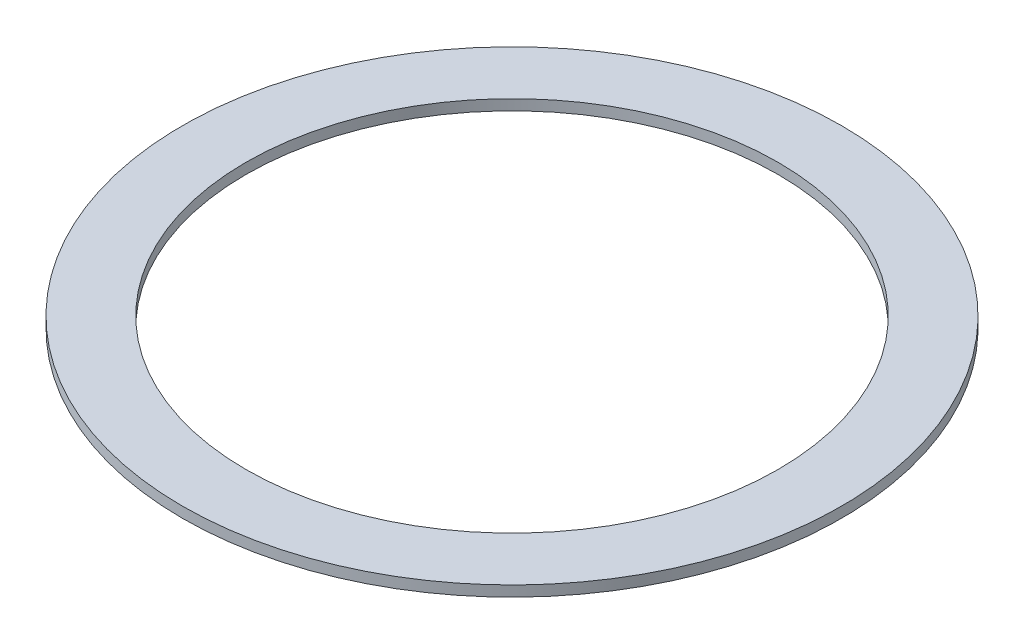
ISO-10303-21;
HEADER;
FILE_DESCRIPTION(('STEP AP214'),'2;1');
FILE_NAME('part.step','',(''),(''),'','','');
FILE_SCHEMA(('AUTOMOTIVE_DESIGN { 1 0 10303 214 1 1 1 1 }'));
ENDSEC;
DATA;
#1=APPLICATION_CONTEXT('core data for automotive mechanical design processes');
#2=APPLICATION_PROTOCOL_DEFINITION('international standard','automotive_design',2000,#1);
#3=PRODUCT_CONTEXT('',#1,'mechanical');
#4=PRODUCT('Part','Part','',(#3));
#5=PRODUCT_RELATED_PRODUCT_CATEGORY('part','',(#4));
#6=PRODUCT_DEFINITION_FORMATION('','',#4);
#7=PRODUCT_DEFINITION_CONTEXT('part definition',#1,'design');
#8=PRODUCT_DEFINITION('design','',#6,#7);
#9=PRODUCT_DEFINITION_SHAPE('','',#8);
#10=(LENGTH_UNIT() NAMED_UNIT(*) SI_UNIT(.MILLI.,.METRE.));
#11=(NAMED_UNIT(*) PLANE_ANGLE_UNIT() SI_UNIT($,.RADIAN.));
#12=(NAMED_UNIT(*) SI_UNIT($,.STERADIAN.) SOLID_ANGLE_UNIT());
#13=UNCERTAINTY_MEASURE_WITH_UNIT(LENGTH_MEASURE(1.E-05),#10,'distance_accuracy_value','');
#14=(GEOMETRIC_REPRESENTATION_CONTEXT(3) GLOBAL_UNCERTAINTY_ASSIGNED_CONTEXT((#13)) GLOBAL_UNIT_ASSIGNED_CONTEXT((#10,
#11,#12)) REPRESENTATION_CONTEXT('',''));
#15=CARTESIAN_POINT('',(0.,0.,0.));
#16=DIRECTION('',(0.,0.,1.));
#17=DIRECTION('',(1.,0.,0.));
#18=AXIS2_PLACEMENT_3D('',#15,#16,#17);
#19=CARTESIAN_POINT('',(0.,0.254,0.));
#20=DIRECTION('',(0.,-1.,0.));
#21=DIRECTION('',(0.,0.,-1.));
#22=AXIS2_PLACEMENT_3D('',#19,#20,#21);
#23=CYLINDRICAL_SURFACE('',#22,7.9121);
#24=CARTESIAN_POINT('',(0.,0.254,0.));
#25=DIRECTION('',(0.,1.,0.));
#26=DIRECTION('',(0.,0.,1.));
#27=AXIS2_PLACEMENT_3D('',#24,#25,#26);
#28=CIRCLE('',#27,7.9121);
#29=CARTESIAN_POINT('',(0.,0.254,7.9121));
#30=VERTEX_POINT('',#29);
#31=EDGE_CURVE('E10',#30,#30,#28,.T.);
#32=ORIENTED_EDGE('',*,*,#31,.F.);
#33=EDGE_LOOP('',(#32));
#34=FACE_BOUND('',#33,.T.);
#35=CARTESIAN_POINT('',(0.,0.,0.));
#36=DIRECTION('',(0.,1.,0.));
#37=DIRECTION('',(0.,0.,1.));
#38=AXIS2_PLACEMENT_3D('',#35,#36,#37);
#39=CIRCLE('',#38,7.9121);
#40=CARTESIAN_POINT('',(0.,0.,7.9121));
#41=VERTEX_POINT('',#40);
#42=EDGE_CURVE('E33',#41,#41,#39,.T.);
#43=ORIENTED_EDGE('',*,*,#42,.T.);
#44=EDGE_LOOP('',(#43));
#45=FACE_BOUND('',#44,.T.);
#46=ADVANCED_FACE('F30',(#34,#45),#23,.T.);
#47=CARTESIAN_POINT('',(0.,0.254,0.));
#48=DIRECTION('',(0.,1.,0.));
#49=DIRECTION('',(0.,0.,1.));
#50=AXIS2_PLACEMENT_3D('',#47,#48,#49);
#51=PLANE('',#50);
#52=CARTESIAN_POINT('',(0.,0.254,0.));
#53=DIRECTION('',(0.,1.,0.));
#54=DIRECTION('',(0.,0.,1.));
#55=AXIS2_PLACEMENT_3D('',#52,#53,#54);
#56=CIRCLE('',#55,6.3881);
#57=CARTESIAN_POINT('',(0.,0.254,6.3881));
#58=VERTEX_POINT('',#57);
#59=EDGE_CURVE('E42',#58,#58,#56,.T.);
#60=ORIENTED_EDGE('',*,*,#59,.F.);
#61=EDGE_LOOP('',(#60));
#62=FACE_BOUND('',#61,.T.);
#63=ORIENTED_EDGE('',*,*,#31,.T.);
#64=EDGE_LOOP('',(#63));
#65=FACE_BOUND('',#64,.T.);
#66=ADVANCED_FACE('F57',(#62,#65),#51,.T.);
#67=CARTESIAN_POINT('',(0.,0.,0.));
#68=DIRECTION('',(0.,1.,0.));
#69=DIRECTION('',(0.,0.,1.));
#70=AXIS2_PLACEMENT_3D('',#67,#68,#69);
#71=PLANE('',#70);
#72=CARTESIAN_POINT('',(0.,0.,0.));
#73=DIRECTION('',(0.,1.,0.));
#74=DIRECTION('',(0.,0.,1.));
#75=AXIS2_PLACEMENT_3D('',#72,#73,#74);
#76=CIRCLE('',#75,6.3881);
#77=CARTESIAN_POINT('',(0.,0.,6.3881));
#78=VERTEX_POINT('',#77);
#79=EDGE_CURVE('E40',#78,#78,#76,.T.);
#80=ORIENTED_EDGE('',*,*,#79,.T.);
#81=EDGE_LOOP('',(#80));
#82=FACE_BOUND('',#81,.T.);
#83=ORIENTED_EDGE('',*,*,#42,.F.);
#84=EDGE_LOOP('',(#83));
#85=FACE_BOUND('',#84,.T.);
#86=ADVANCED_FACE('F48',(#82,#85),#71,.F.);
#87=CARTESIAN_POINT('',(0.,0.,0.));
#88=DIRECTION('',(0.,1.,0.));
#89=DIRECTION('',(0.,0.,1.));
#90=AXIS2_PLACEMENT_3D('',#87,#88,#89);
#91=CYLINDRICAL_SURFACE('',#90,6.3881);
#92=ORIENTED_EDGE('',*,*,#79,.F.);
#93=EDGE_LOOP('',(#92));
#94=FACE_BOUND('',#93,.T.);
#95=ORIENTED_EDGE('',*,*,#59,.T.);
#96=EDGE_LOOP('',(#95));
#97=FACE_BOUND('',#96,.T.);
#98=ADVANCED_FACE('F51',(#94,#97),#91,.F.);
#99=CLOSED_SHELL('',(#46,#66,#86,#98));
#100=MANIFOLD_SOLID_BREP('B2',#99);
#101=ADVANCED_BREP_SHAPE_REPRESENTATION('',(#18,#100),#14);
#102=SHAPE_DEFINITION_REPRESENTATION(#9,#101);
ENDSEC;
END-ISO-10303-21;
